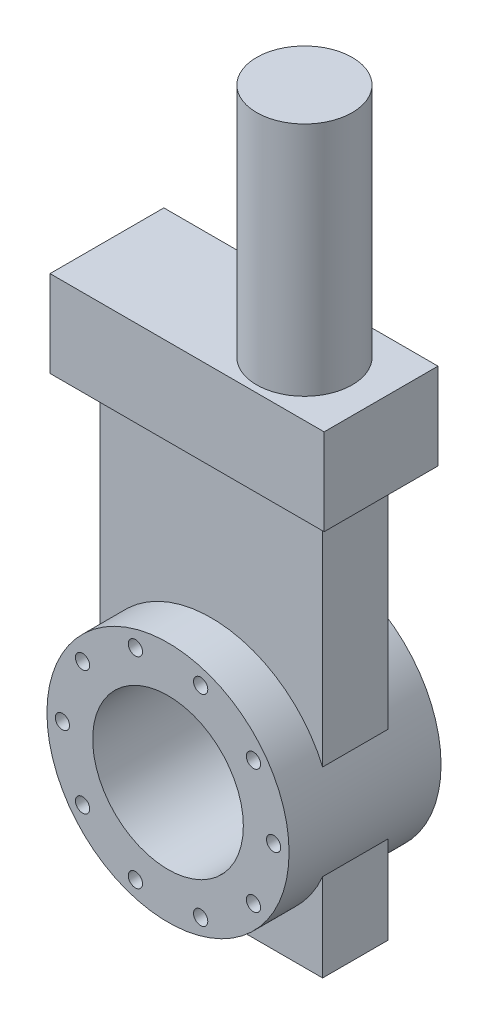
ISO-10303-21;
HEADER;
FILE_DESCRIPTION(('STEP AP214'),'2;1');
FILE_NAME('part.step','',(''),(''),'','','');
FILE_SCHEMA(('AUTOMOTIVE_DESIGN { 1 0 10303 214 1 1 1 1 }'));
ENDSEC;
DATA;
#1=APPLICATION_CONTEXT('core data for automotive mechanical design processes');
#2=APPLICATION_PROTOCOL_DEFINITION('international standard','automotive_design',2000,#1);
#3=PRODUCT_CONTEXT('',#1,'mechanical');
#4=PRODUCT('Part','Part','',(#3));
#5=PRODUCT_RELATED_PRODUCT_CATEGORY('part','',(#4));
#6=PRODUCT_DEFINITION_FORMATION('','',#4);
#7=PRODUCT_DEFINITION_CONTEXT('part definition',#1,'design');
#8=PRODUCT_DEFINITION('design','',#6,#7);
#9=PRODUCT_DEFINITION_SHAPE('','',#8);
#10=(LENGTH_UNIT() NAMED_UNIT(*) SI_UNIT(.MILLI.,.METRE.));
#11=(NAMED_UNIT(*) PLANE_ANGLE_UNIT() SI_UNIT($,.RADIAN.));
#12=(NAMED_UNIT(*) SI_UNIT($,.STERADIAN.) SOLID_ANGLE_UNIT());
#13=UNCERTAINTY_MEASURE_WITH_UNIT(LENGTH_MEASURE(1.E-05),#10,'distance_accuracy_value','');
#14=(GEOMETRIC_REPRESENTATION_CONTEXT(3) GLOBAL_UNCERTAINTY_ASSIGNED_CONTEXT((#13)) GLOBAL_UNIT_ASSIGNED_CONTEXT((#10,
#11,#12)) REPRESENTATION_CONTEXT('',''));
#15=CARTESIAN_POINT('',(0.,0.,0.));
#16=DIRECTION('',(0.,0.,1.));
#17=DIRECTION('',(1.,0.,0.));
#18=AXIS2_PLACEMENT_3D('',#15,#16,#17);
#19=CARTESIAN_POINT('',(-41.6423387636332,48.7154532506677,43.4614345632482));
#20=DIRECTION('',(0.,-1.,0.));
#21=DIRECTION('',(0.,0.,-1.));
#22=AXIS2_PLACEMENT_3D('',#19,#20,#21);
#23=PLANE('',#22);
#24=DIRECTION('',(0.,0.,1.));
#25=VECTOR('',#24,1.);
#26=CARTESIAN_POINT('',(-41.6423387636332,48.7154532506677,-11.7114345632482));
#27=LINE('',#26,#25);
#28=CARTESIAN_POINT('',(-41.6423387636332,48.7154532506677,-11.7114345632482));
#29=VERTEX_POINT('',#28);
#30=CARTESIAN_POINT('',(-41.6423387636332,48.7154532506677,43.4614345632482));
#31=VERTEX_POINT('',#30);
#32=EDGE_CURVE('E124',#29,#31,#27,.T.);
#33=ORIENTED_EDGE('',*,*,#32,.T.);
#34=DIRECTION('',(1.,0.,0.));
#35=VECTOR('',#34,1.);
#36=CARTESIAN_POINT('',(91.1996612363668,48.7154532506677,43.4614345632482));
#37=LINE('',#36,#35);
#38=CARTESIAN_POINT('',(91.1996612363668,48.7154532506677,43.4614345632482));
#39=VERTEX_POINT('',#38);
#40=EDGE_CURVE('E134',#31,#39,#37,.T.);
#41=ORIENTED_EDGE('',*,*,#40,.T.);
#42=DIRECTION('',(0.,0.,-1.));
#43=VECTOR('',#42,1.);
#44=CARTESIAN_POINT('',(91.1996612363668,48.7154532506677,-11.7114345632482));
#45=LINE('',#44,#43);
#46=CARTESIAN_POINT('',(91.1996612363668,48.7154532506677,-11.7114345632482));
#47=VERTEX_POINT('',#46);
#48=EDGE_CURVE('E139',#39,#47,#45,.T.);
#49=ORIENTED_EDGE('',*,*,#48,.T.);
#50=DIRECTION('',(-1.,0.,0.));
#51=VECTOR('',#50,1.);
#52=CARTESIAN_POINT('',(91.1996612363668,48.7154532506677,-11.7114345632482));
#53=LINE('',#52,#51);
#54=EDGE_CURVE('E144',#47,#29,#53,.T.);
#55=ORIENTED_EDGE('',*,*,#54,.T.);
#56=EDGE_LOOP('',(#33,#41,#49,#55));
#57=FACE_BOUND('',#56,.T.);
#58=CARTESIAN_POINT('',(55.1442487211715,48.7154532506677,16.9467266171099));
#59=DIRECTION('',(0.,-1.,0.));
#60=DIRECTION('',(0.,0.,-1.));
#61=AXIS2_PLACEMENT_3D('',#58,#59,#60);
#62=CIRCLE('',#61,23.1745918894452);
#63=CARTESIAN_POINT('',(55.1442487211715,48.7154532506677,-6.22786527233528));
#64=VERTEX_POINT('',#63);
#65=EDGE_CURVE('E11',#64,#64,#62,.F.);
#66=ORIENTED_EDGE('',*,*,#65,.F.);
#67=EDGE_LOOP('',(#66));
#68=FACE_BOUND('',#67,.T.);
#69=ADVANCED_FACE('F31',(#57,#68),#23,.F.);
#70=CARTESIAN_POINT('',(-29.1963387636332,27.7604532506677,31.75));
#71=DIRECTION('',(1.,0.,0.));
#72=DIRECTION('',(0.,1.,0.));
#73=AXIS2_PLACEMENT_3D('',#70,#71,#72);
#74=PLANE('',#73);
#75=DIRECTION('',(0.,-1.,0.));
#76=VECTOR('',#75,1.);
#77=CARTESIAN_POINT('',(-29.1963387636332,27.7604532506677,31.75));
#78=LINE('',#77,#76);
#79=CARTESIAN_POINT('',(-29.1963387636332,6.80545325066767,31.75));
#80=VERTEX_POINT('',#79);
#81=CARTESIAN_POINT('',(-29.1963387636332,-104.045207681113,31.75));
#82=VERTEX_POINT('',#81);
#83=EDGE_CURVE('E257',#80,#82,#78,.T.);
#84=ORIENTED_EDGE('',*,*,#83,.F.);
#85=DIRECTION('',(0.,0.,-1.));
#86=VECTOR('',#85,1.);
#87=CARTESIAN_POINT('',(-29.1963387636332,6.80545325066767,31.75));
#88=LINE('',#87,#86);
#89=CARTESIAN_POINT('',(-29.1963387636332,6.80545325066767,0.));
#90=VERTEX_POINT('',#89);
#91=EDGE_CURVE('E169',#80,#90,#88,.T.);
#92=ORIENTED_EDGE('',*,*,#91,.T.);
#93=DIRECTION('',(0.,-1.,0.));
#94=VECTOR('',#93,1.);
#95=CARTESIAN_POINT('',(-29.1963387636332,27.7604532506677,0.));
#96=LINE('',#95,#94);
#97=CARTESIAN_POINT('',(-29.1963387636332,-104.045207681113,0.));
#98=VERTEX_POINT('',#97);
#99=EDGE_CURVE('E267',#90,#98,#96,.T.);
#100=ORIENTED_EDGE('',*,*,#99,.T.);
#101=DIRECTION('',(0.,0.,1.));
#102=VECTOR('',#101,1.);
#103=CARTESIAN_POINT('',(-29.1963387636332,-104.045207681113,-20.955));
#104=LINE('',#103,#102);
#105=EDGE_CURVE('E254',#98,#82,#104,.T.);
#106=ORIENTED_EDGE('',*,*,#105,.T.);
#107=EDGE_LOOP('',(#84,#92,#100,#106));
#108=FACE_BOUND('',#107,.T.);
#109=ADVANCED_FACE('F327',(#108),#74,.F.);
#110=CARTESIAN_POINT('',(-29.1963387636332,-192.584546749332,31.75));
#111=DIRECTION('',(0.,0.,1.));
#112=DIRECTION('',(1.,0.,0.));
#113=AXIS2_PLACEMENT_3D('',#110,#111,#112);
#114=PLANE('',#113);
#115=DIRECTION('',(1.,0.,0.));
#116=VECTOR('',#115,1.);
#117=CARTESIAN_POINT('',(-29.1963387636332,6.80545325066767,31.75));
#118=LINE('',#117,#116);
#119=CARTESIAN_POINT('',(78.7536612363668,6.80545325066767,31.75));
#120=VERTEX_POINT('',#119);
#121=EDGE_CURVE('E46',#80,#120,#118,.T.);
#122=ORIENTED_EDGE('',*,*,#121,.F.);
#123=ORIENTED_EDGE('',*,*,#83,.T.);
#124=CARTESIAN_POINT('',(24.7786612363668,-127.052546749332,31.75));
#125=DIRECTION('',(0.,0.,1.));
#126=DIRECTION('',(1.,0.,0.));
#127=AXIS2_PLACEMENT_3D('',#124,#125,#126);
#128=CIRCLE('',#127,58.674);
#129=CARTESIAN_POINT('',(78.7536612363668,-104.045207681113,31.75));
#130=VERTEX_POINT('',#129);
#131=EDGE_CURVE('E251',#130,#82,#128,.T.);
#132=ORIENTED_EDGE('',*,*,#131,.F.);
#133=DIRECTION('',(0.,1.,0.));
#134=VECTOR('',#133,1.);
#135=CARTESIAN_POINT('',(78.7536612363668,27.7604532506677,31.75));
#136=LINE('',#135,#134);
#137=EDGE_CURVE('E262',#130,#120,#136,.T.);
#138=ORIENTED_EDGE('',*,*,#137,.T.);
#139=EDGE_LOOP('',(#122,#123,#132,#138));
#140=FACE_BOUND('',#139,.T.);
#141=ADVANCED_FACE('F299',(#140),#114,.T.);
#142=CARTESIAN_POINT('',(-29.1963387636332,-192.584546749332,0.));
#143=DIRECTION('',(0.,0.,1.));
#144=DIRECTION('',(1.,0.,0.));
#145=AXIS2_PLACEMENT_3D('',#142,#143,#144);
#146=PLANE('',#145);
#147=ORIENTED_EDGE('',*,*,#99,.F.);
#148=DIRECTION('',(1.,0.,0.));
#149=VECTOR('',#148,1.);
#150=CARTESIAN_POINT('',(-29.1963387636332,6.80545325066767,0.));
#151=LINE('',#150,#149);
#152=CARTESIAN_POINT('',(78.7536612363668,6.80545325066767,0.));
#153=VERTEX_POINT('',#152);
#154=EDGE_CURVE('E162',#90,#153,#151,.T.);
#155=ORIENTED_EDGE('',*,*,#154,.T.);
#156=DIRECTION('',(0.,1.,0.));
#157=VECTOR('',#156,1.);
#158=CARTESIAN_POINT('',(78.7536612363668,27.7604532506677,0.));
#159=LINE('',#158,#157);
#160=CARTESIAN_POINT('',(78.7536612363668,-104.045207681113,0.));
#161=VERTEX_POINT('',#160);
#162=EDGE_CURVE('E272',#161,#153,#159,.T.);
#163=ORIENTED_EDGE('',*,*,#162,.F.);
#164=CARTESIAN_POINT('',(24.7786612363668,-127.052546749332,0.));
#165=DIRECTION('',(0.,0.,1.));
#166=DIRECTION('',(1.,0.,0.));
#167=AXIS2_PLACEMENT_3D('',#164,#165,#166);
#168=CIRCLE('',#167,58.674);
#169=EDGE_CURVE('E282',#161,#98,#168,.T.);
#170=ORIENTED_EDGE('',*,*,#169,.T.);
#171=EDGE_LOOP('',(#147,#155,#163,#170));
#172=FACE_BOUND('',#171,.T.);
#173=ADVANCED_FACE('F291',(#172),#146,.F.);
#174=CARTESIAN_POINT('',(78.7536612363668,27.7604532506677,31.75));
#175=DIRECTION('',(-1.,0.,0.));
#176=DIRECTION('',(0.,-1.,0.));
#177=AXIS2_PLACEMENT_3D('',#174,#175,#176);
#178=PLANE('',#177);
#179=ORIENTED_EDGE('',*,*,#162,.T.);
#180=DIRECTION('',(0.,0.,1.));
#181=VECTOR('',#180,1.);
#182=CARTESIAN_POINT('',(78.7536612363668,6.80545325066767,31.75));
#183=LINE('',#182,#181);
#184=EDGE_CURVE('E39',#153,#120,#183,.T.);
#185=ORIENTED_EDGE('',*,*,#184,.T.);
#186=ORIENTED_EDGE('',*,*,#137,.F.);
#187=DIRECTION('',(0.,0.,1.));
#188=VECTOR('',#187,1.);
#189=CARTESIAN_POINT('',(78.7536612363668,-104.045207681113,-20.955));
#190=LINE('',#189,#188);
#191=EDGE_CURVE('E250',#130,#161,#190,.F.);
#192=ORIENTED_EDGE('',*,*,#191,.T.);
#193=EDGE_LOOP('',(#179,#185,#186,#192));
#194=FACE_BOUND('',#193,.T.);
#195=ADVANCED_FACE('F297',(#194),#178,.F.);
#196=CARTESIAN_POINT('',(24.7786612363668,-127.052546749332,-20.955));
#197=DIRECTION('',(0.,0.,1.));
#198=DIRECTION('',(1.,0.,0.));
#199=AXIS2_PLACEMENT_3D('',#196,#197,#198);
#200=CYLINDRICAL_SURFACE('',#199,58.674);
#201=ORIENTED_EDGE('',*,*,#191,.F.);
#202=ORIENTED_EDGE('',*,*,#131,.T.);
#203=ORIENTED_EDGE('',*,*,#105,.F.);
#204=ORIENTED_EDGE('',*,*,#169,.F.);
#205=EDGE_LOOP('',(#201,#202,#203,#204));
#206=FACE_BOUND('',#205,.T.);
#207=DIRECTION('',(0.,0.,1.));
#208=VECTOR('',#207,1.);
#209=CARTESIAN_POINT('',(-29.1963387636332,-150.059885817551,-20.955));
#210=LINE('',#209,#208);
#211=CARTESIAN_POINT('',(-29.1963387636332,-150.059885817551,31.75));
#212=VERTEX_POINT('',#211);
#213=CARTESIAN_POINT('',(-29.1963387636332,-150.059885817551,0.));
#214=VERTEX_POINT('',#213);
#215=EDGE_CURVE('E245',#212,#214,#210,.F.);
#216=ORIENTED_EDGE('',*,*,#215,.F.);
#217=CARTESIAN_POINT('',(78.7536612363668,-150.059885817551,31.75));
#218=VERTEX_POINT('',#217);
#219=EDGE_CURVE('E248',#212,#218,#128,.T.);
#220=ORIENTED_EDGE('',*,*,#219,.T.);
#221=DIRECTION('',(0.,0.,1.));
#222=VECTOR('',#221,1.);
#223=CARTESIAN_POINT('',(78.7536612363668,-150.059885817551,-20.955));
#224=LINE('',#223,#222);
#225=CARTESIAN_POINT('',(78.7536612363668,-150.059885817551,0.));
#226=VERTEX_POINT('',#225);
#227=EDGE_CURVE('E54',#226,#218,#224,.T.);
#228=ORIENTED_EDGE('',*,*,#227,.F.);
#229=EDGE_CURVE('E281',#214,#226,#168,.T.);
#230=ORIENTED_EDGE('',*,*,#229,.F.);
#231=EDGE_LOOP('',(#216,#220,#228,#230));
#232=FACE_BOUND('',#231,.T.);
#233=CARTESIAN_POINT('',(24.7786612363668,-127.052546749332,-20.955));
#234=DIRECTION('',(0.,0.,1.));
#235=DIRECTION('',(1.,0.,0.));
#236=AXIS2_PLACEMENT_3D('',#233,#234,#235);
#237=CIRCLE('',#236,58.674);
#238=CARTESIAN_POINT('',(83.4526612363668,-127.052546749332,-20.955));
#239=VERTEX_POINT('',#238);
#240=EDGE_CURVE('E241',#239,#239,#237,.T.);
#241=ORIENTED_EDGE('',*,*,#240,.T.);
#242=EDGE_LOOP('',(#241));
#243=FACE_BOUND('',#242,.T.);
#244=CARTESIAN_POINT('',(24.7786612363668,-127.052546749332,52.705));
#245=DIRECTION('',(0.,0.,1.));
#246=DIRECTION('',(1.,0.,0.));
#247=AXIS2_PLACEMENT_3D('',#244,#245,#246);
#248=CIRCLE('',#247,58.674);
#249=CARTESIAN_POINT('',(83.4526612363668,-127.052546749332,52.705));
#250=VERTEX_POINT('',#249);
#251=EDGE_CURVE('E236',#250,#250,#248,.T.);
#252=ORIENTED_EDGE('',*,*,#251,.F.);
#253=EDGE_LOOP('',(#252));
#254=FACE_BOUND('',#253,.T.);
#255=ADVANCED_FACE('F294',(#206,#232,#243,#254),#200,.T.);
#256=CARTESIAN_POINT('',(24.7786612363668,-127.052546749332,-20.955));
#257=DIRECTION('',(0.,0.,1.));
#258=DIRECTION('',(1.,0.,0.));
#259=AXIS2_PLACEMENT_3D('',#256,#257,#258);
#260=PLANE('',#259);
#261=CARTESIAN_POINT('',(40.5944600254703,-78.3765231888299,-20.955));
#262=DIRECTION('',(0.,0.,1.));
#263=DIRECTION('',(1.,0.,0.));
#264=AXIS2_PLACEMENT_3D('',#261,#262,#263);
#265=CIRCLE('',#264,3.45439999999998);
#266=CARTESIAN_POINT('',(44.0488600254702,-78.3765231888299,-20.955));
#267=VERTEX_POINT('',#266);
#268=EDGE_CURVE('E175',#267,#267,#265,.T.);
#269=ORIENTED_EDGE('',*,*,#268,.T.);
#270=EDGE_LOOP('',(#269));
#271=FACE_BOUND('',#270,.T.);
#272=CARTESIAN_POINT('',(66.1849600254706,-96.9691097517508,-20.955));
#273=DIRECTION('',(0.,0.,1.));
#274=DIRECTION('',(1.,0.,0.));
#275=AXIS2_PLACEMENT_3D('',#272,#273,#274);
#276=CIRCLE('',#275,3.45439999999998);
#277=CARTESIAN_POINT('',(69.6393600254706,-96.9691097517508,-20.955));
#278=VERTEX_POINT('',#277);
#279=EDGE_CURVE('E181',#278,#278,#276,.T.);
#280=ORIENTED_EDGE('',*,*,#279,.T.);
#281=EDGE_LOOP('',(#280));
#282=FACE_BOUND('',#281,.T.);
#283=CARTESIAN_POINT('',(75.9596612363668,-127.052546749332,-20.955));
#284=DIRECTION('',(0.,0.,1.));
#285=DIRECTION('',(1.,0.,0.));
#286=AXIS2_PLACEMENT_3D('',#283,#284,#285);
#287=CIRCLE('',#286,3.45439999999998);
#288=CARTESIAN_POINT('',(79.4140612363668,-127.052546749332,-20.955));
#289=VERTEX_POINT('',#288);
#290=EDGE_CURVE('E187',#289,#289,#287,.T.);
#291=ORIENTED_EDGE('',*,*,#290,.T.);
#292=EDGE_LOOP('',(#291));
#293=FACE_BOUND('',#292,.T.);
#294=CARTESIAN_POINT('',(66.1849600254713,-157.135983746913,-20.955));
#295=DIRECTION('',(0.,0.,1.));
#296=DIRECTION('',(1.,0.,0.));
#297=AXIS2_PLACEMENT_3D('',#294,#295,#296);
#298=CIRCLE('',#297,3.45439999999998);
#299=CARTESIAN_POINT('',(69.6393600254712,-157.135983746913,-20.955));
#300=VERTEX_POINT('',#299);
#301=EDGE_CURVE('E193',#300,#300,#298,.T.);
#302=ORIENTED_EDGE('',*,*,#301,.T.);
#303=EDGE_LOOP('',(#302));
#304=FACE_BOUND('',#303,.T.);
#305=CARTESIAN_POINT('',(40.5944600254714,-175.728570309835,-20.955));
#306=DIRECTION('',(0.,0.,1.));
#307=DIRECTION('',(1.,0.,0.));
#308=AXIS2_PLACEMENT_3D('',#305,#306,#307);
#309=CIRCLE('',#308,3.45439999999998);
#310=CARTESIAN_POINT('',(44.0488600254713,-175.728570309835,-20.955));
#311=VERTEX_POINT('',#310);
#312=EDGE_CURVE('E199',#311,#311,#309,.T.);
#313=ORIENTED_EDGE('',*,*,#312,.T.);
#314=EDGE_LOOP('',(#313));
#315=FACE_BOUND('',#314,.T.);
#316=CARTESIAN_POINT('',(8.96286244726292,-175.728570309835,-20.955));
#317=DIRECTION('',(0.,0.,1.));
#318=DIRECTION('',(1.,0.,0.));
#319=AXIS2_PLACEMENT_3D('',#316,#317,#318);
#320=CIRCLE('',#319,3.45439999999998);
#321=CARTESIAN_POINT('',(12.4172624472629,-175.728570309835,-20.955));
#322=VERTEX_POINT('',#321);
#323=EDGE_CURVE('E205',#322,#322,#320,.T.);
#324=ORIENTED_EDGE('',*,*,#323,.T.);
#325=EDGE_LOOP('',(#324));
#326=FACE_BOUND('',#325,.T.);
#327=CARTESIAN_POINT('',(-16.6276375527372,-157.135983746914,-20.955));
#328=DIRECTION('',(0.,0.,1.));
#329=DIRECTION('',(1.,0.,0.));
#330=AXIS2_PLACEMENT_3D('',#327,#328,#329);
#331=CIRCLE('',#330,3.45439999999998);
#332=CARTESIAN_POINT('',(-13.1732375527373,-157.135983746914,-20.955));
#333=VERTEX_POINT('',#332);
#334=EDGE_CURVE('E211',#333,#333,#331,.T.);
#335=ORIENTED_EDGE('',*,*,#334,.T.);
#336=EDGE_LOOP('',(#335));
#337=FACE_BOUND('',#336,.T.);
#338=CARTESIAN_POINT('',(-26.4023387636332,-127.052546749333,-20.955));
#339=DIRECTION('',(0.,0.,1.));
#340=DIRECTION('',(1.,0.,0.));
#341=AXIS2_PLACEMENT_3D('',#338,#339,#340);
#342=CIRCLE('',#341,3.45439999999998);
#343=CARTESIAN_POINT('',(-22.9479387636332,-127.052546749333,-20.955));
#344=VERTEX_POINT('',#343);
#345=EDGE_CURVE('E217',#344,#344,#342,.T.);
#346=ORIENTED_EDGE('',*,*,#345,.T.);
#347=EDGE_LOOP('',(#346));
#348=FACE_BOUND('',#347,.T.);
#349=CARTESIAN_POINT('',(-16.6276375527375,-96.9691097517514,-20.955));
#350=DIRECTION('',(0.,0.,1.));
#351=DIRECTION('',(1.,0.,0.));
#352=AXIS2_PLACEMENT_3D('',#349,#350,#351);
#353=CIRCLE('',#352,3.45439999999998);
#354=CARTESIAN_POINT('',(-13.1732375527375,-96.9691097517514,-20.955));
#355=VERTEX_POINT('',#354);
#356=EDGE_CURVE('E223',#355,#355,#353,.T.);
#357=ORIENTED_EDGE('',*,*,#356,.T.);
#358=EDGE_LOOP('',(#357));
#359=FACE_BOUND('',#358,.T.);
#360=CARTESIAN_POINT('',(8.96286244726254,-78.3765231888301,-20.955));
#361=DIRECTION('',(0.,0.,1.));
#362=DIRECTION('',(1.,0.,0.));
#363=AXIS2_PLACEMENT_3D('',#360,#361,#362);
#364=CIRCLE('',#363,3.45439999999998);
#365=CARTESIAN_POINT('',(12.4172624472625,-78.3765231888301,-20.955));
#366=VERTEX_POINT('',#365);
#367=EDGE_CURVE('E229',#366,#366,#364,.T.);
#368=ORIENTED_EDGE('',*,*,#367,.T.);
#369=EDGE_LOOP('',(#368));
#370=FACE_BOUND('',#369,.T.);
#371=CARTESIAN_POINT('',(24.7786612363668,-127.052546749332,-20.955));
#372=DIRECTION('',(0.,0.,1.));
#373=DIRECTION('',(1.,0.,0.));
#374=AXIS2_PLACEMENT_3D('',#371,#372,#373);
#375=CIRCLE('',#374,36.5125);
#376=CARTESIAN_POINT('',(61.2911612363668,-127.052546749332,-20.955));
#377=VERTEX_POINT('',#376);
#378=EDGE_CURVE('E233',#377,#377,#375,.T.);
#379=ORIENTED_EDGE('',*,*,#378,.T.);
#380=EDGE_LOOP('',(#379));
#381=FACE_BOUND('',#380,.T.);
#382=ORIENTED_EDGE('',*,*,#240,.F.);
#383=EDGE_LOOP('',(#382));
#384=FACE_BOUND('',#383,.T.);
#385=ADVANCED_FACE('F402',(#271,#282,#293,#304,#315,#326,#337,#348,#359,#370,#381,#384),#260,.F.);
#386=CARTESIAN_POINT('',(24.7786612363668,-127.052546749332,52.705));
#387=DIRECTION('',(0.,0.,1.));
#388=DIRECTION('',(1.,0.,0.));
#389=AXIS2_PLACEMENT_3D('',#386,#387,#388);
#390=PLANE('',#389);
#391=CARTESIAN_POINT('',(40.5944600254703,-78.3765231888299,52.705));
#392=DIRECTION('',(0.,0.,1.));
#393=DIRECTION('',(1.,0.,0.));
#394=AXIS2_PLACEMENT_3D('',#391,#392,#393);
#395=CIRCLE('',#394,3.45439999999999);
#396=CARTESIAN_POINT('',(44.0488600254703,-78.3765231888299,52.705));
#397=VERTEX_POINT('',#396);
#398=EDGE_CURVE('E172',#397,#397,#395,.T.);
#399=ORIENTED_EDGE('',*,*,#398,.F.);
#400=EDGE_LOOP('',(#399));
#401=FACE_BOUND('',#400,.T.);
#402=CARTESIAN_POINT('',(66.1849600254706,-96.9691097517508,52.705));
#403=DIRECTION('',(0.,0.,1.));
#404=DIRECTION('',(1.,0.,0.));
#405=AXIS2_PLACEMENT_3D('',#402,#403,#404);
#406=CIRCLE('',#405,3.45439999999998);
#407=CARTESIAN_POINT('',(69.6393600254706,-96.9691097517508,52.705));
#408=VERTEX_POINT('',#407);
#409=EDGE_CURVE('E178',#408,#408,#406,.T.);
#410=ORIENTED_EDGE('',*,*,#409,.F.);
#411=EDGE_LOOP('',(#410));
#412=FACE_BOUND('',#411,.T.);
#413=CARTESIAN_POINT('',(75.9596612363668,-127.052546749332,52.705));
#414=DIRECTION('',(0.,0.,1.));
#415=DIRECTION('',(1.,0.,0.));
#416=AXIS2_PLACEMENT_3D('',#413,#414,#415);
#417=CIRCLE('',#416,3.45439999999998);
#418=CARTESIAN_POINT('',(79.4140612363668,-127.052546749332,52.705));
#419=VERTEX_POINT('',#418);
#420=EDGE_CURVE('E184',#419,#419,#417,.T.);
#421=ORIENTED_EDGE('',*,*,#420,.F.);
#422=EDGE_LOOP('',(#421));
#423=FACE_BOUND('',#422,.T.);
#424=CARTESIAN_POINT('',(66.1849600254713,-157.135983746913,52.705));
#425=DIRECTION('',(0.,0.,1.));
#426=DIRECTION('',(1.,0.,0.));
#427=AXIS2_PLACEMENT_3D('',#424,#425,#426);
#428=CIRCLE('',#427,3.45439999999998);
#429=CARTESIAN_POINT('',(69.6393600254712,-157.135983746913,52.705));
#430=VERTEX_POINT('',#429);
#431=EDGE_CURVE('E190',#430,#430,#428,.T.);
#432=ORIENTED_EDGE('',*,*,#431,.F.);
#433=EDGE_LOOP('',(#432));
#434=FACE_BOUND('',#433,.T.);
#435=CARTESIAN_POINT('',(40.5944600254714,-175.728570309835,52.705));
#436=DIRECTION('',(0.,0.,1.));
#437=DIRECTION('',(1.,0.,0.));
#438=AXIS2_PLACEMENT_3D('',#435,#436,#437);
#439=CIRCLE('',#438,3.45439999999999);
#440=CARTESIAN_POINT('',(44.0488600254713,-175.728570309835,52.705));
#441=VERTEX_POINT('',#440);
#442=EDGE_CURVE('E196',#441,#441,#439,.T.);
#443=ORIENTED_EDGE('',*,*,#442,.F.);
#444=EDGE_LOOP('',(#443));
#445=FACE_BOUND('',#444,.T.);
#446=CARTESIAN_POINT('',(8.96286244726292,-175.728570309835,52.705));
#447=DIRECTION('',(0.,0.,1.));
#448=DIRECTION('',(1.,0.,0.));
#449=AXIS2_PLACEMENT_3D('',#446,#447,#448);
#450=CIRCLE('',#449,3.45439999999999);
#451=CARTESIAN_POINT('',(12.4172624472629,-175.728570309835,52.705));
#452=VERTEX_POINT('',#451);
#453=EDGE_CURVE('E202',#452,#452,#450,.T.);
#454=ORIENTED_EDGE('',*,*,#453,.F.);
#455=EDGE_LOOP('',(#454));
#456=FACE_BOUND('',#455,.T.);
#457=CARTESIAN_POINT('',(-16.6276375527372,-157.135983746914,52.705));
#458=DIRECTION('',(0.,0.,1.));
#459=DIRECTION('',(1.,0.,0.));
#460=AXIS2_PLACEMENT_3D('',#457,#458,#459);
#461=CIRCLE('',#460,3.45439999999999);
#462=CARTESIAN_POINT('',(-13.1732375527373,-157.135983746914,52.705));
#463=VERTEX_POINT('',#462);
#464=EDGE_CURVE('E208',#463,#463,#461,.T.);
#465=ORIENTED_EDGE('',*,*,#464,.F.);
#466=EDGE_LOOP('',(#465));
#467=FACE_BOUND('',#466,.T.);
#468=CARTESIAN_POINT('',(-26.4023387636332,-127.052546749333,52.705));
#469=DIRECTION('',(0.,0.,1.));
#470=DIRECTION('',(1.,0.,0.));
#471=AXIS2_PLACEMENT_3D('',#468,#469,#470);
#472=CIRCLE('',#471,3.45439999999999);
#473=CARTESIAN_POINT('',(-22.9479387636332,-127.052546749333,52.705));
#474=VERTEX_POINT('',#473);
#475=EDGE_CURVE('E214',#474,#474,#472,.T.);
#476=ORIENTED_EDGE('',*,*,#475,.F.);
#477=EDGE_LOOP('',(#476));
#478=FACE_BOUND('',#477,.T.);
#479=CARTESIAN_POINT('',(-16.6276375527375,-96.9691097517514,52.705));
#480=DIRECTION('',(0.,0.,1.));
#481=DIRECTION('',(1.,0.,0.));
#482=AXIS2_PLACEMENT_3D('',#479,#480,#481);
#483=CIRCLE('',#482,3.45439999999999);
#484=CARTESIAN_POINT('',(-13.1732375527375,-96.9691097517514,52.705));
#485=VERTEX_POINT('',#484);
#486=EDGE_CURVE('E220',#485,#485,#483,.T.);
#487=ORIENTED_EDGE('',*,*,#486,.F.);
#488=EDGE_LOOP('',(#487));
#489=FACE_BOUND('',#488,.T.);
#490=CARTESIAN_POINT('',(8.96286244726254,-78.3765231888301,52.705));
#491=DIRECTION('',(0.,0.,1.));
#492=DIRECTION('',(1.,0.,0.));
#493=AXIS2_PLACEMENT_3D('',#490,#491,#492);
#494=CIRCLE('',#493,3.45439999999999);
#495=CARTESIAN_POINT('',(12.4172624472625,-78.3765231888301,52.705));
#496=VERTEX_POINT('',#495);
#497=EDGE_CURVE('E226',#496,#496,#494,.T.);
#498=ORIENTED_EDGE('',*,*,#497,.F.);
#499=EDGE_LOOP('',(#498));
#500=FACE_BOUND('',#499,.T.);
#501=CARTESIAN_POINT('',(24.7786612363668,-127.052546749332,52.705));
#502=DIRECTION('',(0.,0.,1.));
#503=DIRECTION('',(1.,0.,0.));
#504=AXIS2_PLACEMENT_3D('',#501,#502,#503);
#505=CIRCLE('',#504,36.5125);
#506=CARTESIAN_POINT('',(61.2911612363668,-127.052546749332,52.705));
#507=VERTEX_POINT('',#506);
#508=EDGE_CURVE('E232',#507,#507,#505,.T.);
#509=ORIENTED_EDGE('',*,*,#508,.F.);
#510=EDGE_LOOP('',(#509));
#511=FACE_BOUND('',#510,.T.);
#512=ORIENTED_EDGE('',*,*,#251,.T.);
#513=EDGE_LOOP('',(#512));
#514=FACE_BOUND('',#513,.T.);
#515=ADVANCED_FACE('F399',(#401,#412,#423,#434,#445,#456,#467,#478,#489,#500,#511,#514),#390,.T.);
#516=CARTESIAN_POINT('',(-29.1963387636332,-192.584546749332,31.75));
#517=DIRECTION('',(0.,1.,0.));
#518=DIRECTION('',(0.,0.,1.));
#519=AXIS2_PLACEMENT_3D('',#516,#517,#518);
#520=PLANE('',#519);
#521=DIRECTION('',(1.,0.,0.));
#522=VECTOR('',#521,1.);
#523=CARTESIAN_POINT('',(-29.1963387636332,-192.584546749332,0.));
#524=LINE('',#523,#522);
#525=CARTESIAN_POINT('',(-29.1963387636332,-192.584546749332,0.));
#526=VERTEX_POINT('',#525);
#527=CARTESIAN_POINT('',(78.7536612363668,-192.584546749332,0.));
#528=VERTEX_POINT('',#527);
#529=EDGE_CURVE('E269',#526,#528,#524,.T.);
#530=ORIENTED_EDGE('',*,*,#529,.T.);
#531=DIRECTION('',(0.,0.,-1.));
#532=VECTOR('',#531,1.);
#533=CARTESIAN_POINT('',(78.7536612363668,-192.584546749332,31.75));
#534=LINE('',#533,#532);
#535=CARTESIAN_POINT('',(78.7536612363668,-192.584546749332,31.75));
#536=VERTEX_POINT('',#535);
#537=EDGE_CURVE('E266',#536,#528,#534,.T.);
#538=ORIENTED_EDGE('',*,*,#537,.F.);
#539=DIRECTION('',(1.,0.,0.));
#540=VECTOR('',#539,1.);
#541=CARTESIAN_POINT('',(-29.1963387636332,-192.584546749332,31.75));
#542=LINE('',#541,#540);
#543=CARTESIAN_POINT('',(-29.1963387636332,-192.584546749332,31.75));
#544=VERTEX_POINT('',#543);
#545=EDGE_CURVE('E259',#544,#536,#542,.T.);
#546=ORIENTED_EDGE('',*,*,#545,.F.);
#547=DIRECTION('',(0.,0.,-1.));
#548=VECTOR('',#547,1.);
#549=CARTESIAN_POINT('',(-29.1963387636332,-192.584546749332,31.75));
#550=LINE('',#549,#548);
#551=EDGE_CURVE('E278',#544,#526,#550,.T.);
#552=ORIENTED_EDGE('',*,*,#551,.T.);
#553=EDGE_LOOP('',(#530,#538,#546,#552));
#554=FACE_BOUND('',#553,.T.);
#555=ADVANCED_FACE('F312',(#554),#520,.F.);
#556=ORIENTED_EDGE('',*,*,#219,.F.);
#557=EDGE_CURVE('E260',#212,#544,#78,.T.);
#558=ORIENTED_EDGE('',*,*,#557,.T.);
#559=ORIENTED_EDGE('',*,*,#545,.T.);
#560=EDGE_CURVE('E263',#536,#218,#136,.T.);
#561=ORIENTED_EDGE('',*,*,#560,.T.);
#562=EDGE_LOOP('',(#556,#558,#559,#561));
#563=FACE_BOUND('',#562,.T.);
#564=ADVANCED_FACE('F316',(#563),#114,.T.);
#565=EDGE_CURVE('E270',#214,#526,#96,.T.);
#566=ORIENTED_EDGE('',*,*,#565,.F.);
#567=ORIENTED_EDGE('',*,*,#229,.T.);
#568=EDGE_CURVE('E273',#528,#226,#159,.T.);
#569=ORIENTED_EDGE('',*,*,#568,.F.);
#570=ORIENTED_EDGE('',*,*,#529,.F.);
#571=EDGE_LOOP('',(#566,#567,#569,#570));
#572=FACE_BOUND('',#571,.T.);
#573=ADVANCED_FACE('F308',(#572),#146,.F.);
#574=ORIENTED_EDGE('',*,*,#568,.T.);
#575=ORIENTED_EDGE('',*,*,#227,.T.);
#576=ORIENTED_EDGE('',*,*,#560,.F.);
#577=ORIENTED_EDGE('',*,*,#537,.T.);
#578=EDGE_LOOP('',(#574,#575,#576,#577));
#579=FACE_BOUND('',#578,.T.);
#580=ADVANCED_FACE('F319',(#579),#178,.F.);
#581=ORIENTED_EDGE('',*,*,#557,.F.);
#582=ORIENTED_EDGE('',*,*,#215,.T.);
#583=ORIENTED_EDGE('',*,*,#565,.T.);
#584=ORIENTED_EDGE('',*,*,#551,.F.);
#585=EDGE_LOOP('',(#581,#582,#583,#584));
#586=FACE_BOUND('',#585,.T.);
#587=ADVANCED_FACE('F33',(#586),#74,.F.);
#588=CARTESIAN_POINT('',(24.7786612363668,-127.052546749332,-20.955));
#589=DIRECTION('',(0.,0.,1.));
#590=DIRECTION('',(1.,0.,0.));
#591=AXIS2_PLACEMENT_3D('',#588,#589,#590);
#592=CYLINDRICAL_SURFACE('',#591,36.5125);
#593=ORIENTED_EDGE('',*,*,#378,.F.);
#594=EDGE_LOOP('',(#593));
#595=FACE_BOUND('',#594,.T.);
#596=ORIENTED_EDGE('',*,*,#508,.T.);
#597=EDGE_LOOP('',(#596));
#598=FACE_BOUND('',#597,.T.);
#599=ADVANCED_FACE('F326',(#595,#598),#592,.F.);
#600=CARTESIAN_POINT('',(8.96286244726254,-78.3765231888301,52.705));
#601=DIRECTION('',(0.,0.,1.));
#602=DIRECTION('',(1.,0.,0.));
#603=AXIS2_PLACEMENT_3D('',#600,#601,#602);
#604=CYLINDRICAL_SURFACE('',#603,3.45439999999999);
#605=ORIENTED_EDGE('',*,*,#367,.F.);
#606=EDGE_LOOP('',(#605));
#607=FACE_BOUND('',#606,.T.);
#608=ORIENTED_EDGE('',*,*,#497,.T.);
#609=EDGE_LOOP('',(#608));
#610=FACE_BOUND('',#609,.T.);
#611=ADVANCED_FACE('F391',(#607,#610),#604,.F.);
#612=CARTESIAN_POINT('',(-16.6276375527375,-96.9691097517514,52.705));
#613=DIRECTION('',(0.,0.,1.));
#614=DIRECTION('',(1.,0.,0.));
#615=AXIS2_PLACEMENT_3D('',#612,#613,#614);
#616=CYLINDRICAL_SURFACE('',#615,3.45439999999999);
#617=ORIENTED_EDGE('',*,*,#356,.F.);
#618=EDGE_LOOP('',(#617));
#619=FACE_BOUND('',#618,.T.);
#620=ORIENTED_EDGE('',*,*,#486,.T.);
#621=EDGE_LOOP('',(#620));
#622=FACE_BOUND('',#621,.T.);
#623=ADVANCED_FACE('F387',(#619,#622),#616,.F.);
#624=CARTESIAN_POINT('',(-26.4023387636332,-127.052546749333,52.705));
#625=DIRECTION('',(0.,0.,1.));
#626=DIRECTION('',(1.,0.,0.));
#627=AXIS2_PLACEMENT_3D('',#624,#625,#626);
#628=CYLINDRICAL_SURFACE('',#627,3.45439999999999);
#629=ORIENTED_EDGE('',*,*,#345,.F.);
#630=EDGE_LOOP('',(#629));
#631=FACE_BOUND('',#630,.T.);
#632=ORIENTED_EDGE('',*,*,#475,.T.);
#633=EDGE_LOOP('',(#632));
#634=FACE_BOUND('',#633,.T.);
#635=ADVANCED_FACE('F383',(#631,#634),#628,.F.);
#636=CARTESIAN_POINT('',(-16.6276375527372,-157.135983746914,52.705));
#637=DIRECTION('',(0.,0.,1.));
#638=DIRECTION('',(1.,0.,0.));
#639=AXIS2_PLACEMENT_3D('',#636,#637,#638);
#640=CYLINDRICAL_SURFACE('',#639,3.45439999999999);
#641=ORIENTED_EDGE('',*,*,#334,.F.);
#642=EDGE_LOOP('',(#641));
#643=FACE_BOUND('',#642,.T.);
#644=ORIENTED_EDGE('',*,*,#464,.T.);
#645=EDGE_LOOP('',(#644));
#646=FACE_BOUND('',#645,.T.);
#647=ADVANCED_FACE('F379',(#643,#646),#640,.F.);
#648=CARTESIAN_POINT('',(8.96286244726292,-175.728570309835,52.705));
#649=DIRECTION('',(0.,0.,1.));
#650=DIRECTION('',(1.,0.,0.));
#651=AXIS2_PLACEMENT_3D('',#648,#649,#650);
#652=CYLINDRICAL_SURFACE('',#651,3.45439999999999);
#653=ORIENTED_EDGE('',*,*,#323,.F.);
#654=EDGE_LOOP('',(#653));
#655=FACE_BOUND('',#654,.T.);
#656=ORIENTED_EDGE('',*,*,#453,.T.);
#657=EDGE_LOOP('',(#656));
#658=FACE_BOUND('',#657,.T.);
#659=ADVANCED_FACE('F375',(#655,#658),#652,.F.);
#660=CARTESIAN_POINT('',(40.5944600254714,-175.728570309835,52.705));
#661=DIRECTION('',(0.,0.,1.));
#662=DIRECTION('',(1.,0.,0.));
#663=AXIS2_PLACEMENT_3D('',#660,#661,#662);
#664=CYLINDRICAL_SURFACE('',#663,3.45439999999999);
#665=ORIENTED_EDGE('',*,*,#312,.F.);
#666=EDGE_LOOP('',(#665));
#667=FACE_BOUND('',#666,.T.);
#668=ORIENTED_EDGE('',*,*,#442,.T.);
#669=EDGE_LOOP('',(#668));
#670=FACE_BOUND('',#669,.T.);
#671=ADVANCED_FACE('F371',(#667,#670),#664,.F.);
#672=CARTESIAN_POINT('',(66.1849600254713,-157.135983746913,52.705));
#673=DIRECTION('',(0.,0.,1.));
#674=DIRECTION('',(1.,0.,0.));
#675=AXIS2_PLACEMENT_3D('',#672,#673,#674);
#676=CYLINDRICAL_SURFACE('',#675,3.45439999999998);
#677=ORIENTED_EDGE('',*,*,#301,.F.);
#678=EDGE_LOOP('',(#677));
#679=FACE_BOUND('',#678,.T.);
#680=ORIENTED_EDGE('',*,*,#431,.T.);
#681=EDGE_LOOP('',(#680));
#682=FACE_BOUND('',#681,.T.);
#683=ADVANCED_FACE('F367',(#679,#682),#676,.F.);
#684=CARTESIAN_POINT('',(75.9596612363668,-127.052546749332,52.705));
#685=DIRECTION('',(0.,0.,1.));
#686=DIRECTION('',(1.,0.,0.));
#687=AXIS2_PLACEMENT_3D('',#684,#685,#686);
#688=CYLINDRICAL_SURFACE('',#687,3.45439999999998);
#689=ORIENTED_EDGE('',*,*,#290,.F.);
#690=EDGE_LOOP('',(#689));
#691=FACE_BOUND('',#690,.T.);
#692=ORIENTED_EDGE('',*,*,#420,.T.);
#693=EDGE_LOOP('',(#692));
#694=FACE_BOUND('',#693,.T.);
#695=ADVANCED_FACE('F363',(#691,#694),#688,.F.);
#696=CARTESIAN_POINT('',(66.1849600254706,-96.9691097517508,52.705));
#697=DIRECTION('',(0.,0.,1.));
#698=DIRECTION('',(1.,0.,0.));
#699=AXIS2_PLACEMENT_3D('',#696,#697,#698);
#700=CYLINDRICAL_SURFACE('',#699,3.45439999999998);
#701=ORIENTED_EDGE('',*,*,#279,.F.);
#702=EDGE_LOOP('',(#701));
#703=FACE_BOUND('',#702,.T.);
#704=ORIENTED_EDGE('',*,*,#409,.T.);
#705=EDGE_LOOP('',(#704));
#706=FACE_BOUND('',#705,.T.);
#707=ADVANCED_FACE('F359',(#703,#706),#700,.F.);
#708=CARTESIAN_POINT('',(40.5944600254703,-78.3765231888299,52.705));
#709=DIRECTION('',(0.,0.,1.));
#710=DIRECTION('',(1.,0.,0.));
#711=AXIS2_PLACEMENT_3D('',#708,#709,#710);
#712=CYLINDRICAL_SURFACE('',#711,3.45439999999999);
#713=ORIENTED_EDGE('',*,*,#268,.F.);
#714=EDGE_LOOP('',(#713));
#715=FACE_BOUND('',#714,.T.);
#716=ORIENTED_EDGE('',*,*,#398,.T.);
#717=EDGE_LOOP('',(#716));
#718=FACE_BOUND('',#717,.T.);
#719=ADVANCED_FACE('F343',(#715,#718),#712,.F.);
#720=CARTESIAN_POINT('',(-41.6423387636332,6.80545325066767,43.4614345632482));
#721=DIRECTION('',(0.,-1.,0.));
#722=DIRECTION('',(0.,0.,-1.));
#723=AXIS2_PLACEMENT_3D('',#720,#721,#722);
#724=PLANE('',#723);
#725=DIRECTION('',(0.,0.,1.));
#726=VECTOR('',#725,1.);
#727=CARTESIAN_POINT('',(-41.6423387636332,6.80545325066767,-11.7114345632482));
#728=LINE('',#727,#726);
#729=CARTESIAN_POINT('',(-41.6423387636332,6.80545325066767,-11.7114345632482));
#730=VERTEX_POINT('',#729);
#731=CARTESIAN_POINT('',(-41.6423387636332,6.80545325066767,43.4614345632482));
#732=VERTEX_POINT('',#731);
#733=EDGE_CURVE('E126',#730,#732,#728,.T.);
#734=ORIENTED_EDGE('',*,*,#733,.F.);
#735=DIRECTION('',(-1.,0.,0.));
#736=VECTOR('',#735,1.);
#737=CARTESIAN_POINT('',(91.1996612363668,6.80545325066767,-11.7114345632482));
#738=LINE('',#737,#736);
#739=CARTESIAN_POINT('',(91.1996612363668,6.80545325066767,-11.7114345632482));
#740=VERTEX_POINT('',#739);
#741=EDGE_CURVE('E131',#740,#730,#738,.T.);
#742=ORIENTED_EDGE('',*,*,#741,.F.);
#743=DIRECTION('',(0.,0.,-1.));
#744=VECTOR('',#743,1.);
#745=CARTESIAN_POINT('',(91.1996612363668,6.80545325066767,-11.7114345632482));
#746=LINE('',#745,#744);
#747=CARTESIAN_POINT('',(91.1996612363668,6.80545325066767,43.4614345632482));
#748=VERTEX_POINT('',#747);
#749=EDGE_CURVE('E155',#748,#740,#746,.T.);
#750=ORIENTED_EDGE('',*,*,#749,.F.);
#751=DIRECTION('',(1.,0.,0.));
#752=VECTOR('',#751,1.);
#753=CARTESIAN_POINT('',(91.1996612363668,6.80545325066767,43.4614345632482));
#754=LINE('',#753,#752);
#755=EDGE_CURVE('E153',#732,#748,#754,.T.);
#756=ORIENTED_EDGE('',*,*,#755,.F.);
#757=EDGE_LOOP('',(#734,#742,#750,#756));
#758=FACE_BOUND('',#757,.T.);
#759=ORIENTED_EDGE('',*,*,#91,.F.);
#760=ORIENTED_EDGE('',*,*,#121,.T.);
#761=ORIENTED_EDGE('',*,*,#184,.F.);
#762=ORIENTED_EDGE('',*,*,#154,.F.);
#763=EDGE_LOOP('',(#759,#760,#761,#762));
#764=FACE_BOUND('',#763,.T.);
#765=ADVANCED_FACE('F340',(#758,#764),#724,.T.);
#766=CARTESIAN_POINT('',(-41.6423387636332,6.80545325066767,-11.7114345632482));
#767=DIRECTION('',(-1.,0.,0.));
#768=DIRECTION('',(0.,0.,1.));
#769=AXIS2_PLACEMENT_3D('',#766,#767,#768);
#770=PLANE('',#769);
#771=DIRECTION('',(0.,1.,0.));
#772=VECTOR('',#771,1.);
#773=CARTESIAN_POINT('',(-41.6423387636332,6.80545325066767,43.4614345632482));
#774=LINE('',#773,#772);
#775=EDGE_CURVE('E120',#732,#31,#774,.T.);
#776=ORIENTED_EDGE('',*,*,#775,.T.);
#777=ORIENTED_EDGE('',*,*,#32,.F.);
#778=DIRECTION('',(0.,1.,0.));
#779=VECTOR('',#778,1.);
#780=CARTESIAN_POINT('',(-41.6423387636332,6.80545325066767,-11.7114345632482));
#781=LINE('',#780,#779);
#782=EDGE_CURVE('E160',#730,#29,#781,.T.);
#783=ORIENTED_EDGE('',*,*,#782,.F.);
#784=ORIENTED_EDGE('',*,*,#733,.T.);
#785=EDGE_LOOP('',(#776,#777,#783,#784));
#786=FACE_BOUND('',#785,.T.);
#787=ADVANCED_FACE('F122',(#786),#770,.T.);
#788=CARTESIAN_POINT('',(91.1996612363668,6.80545325066767,-11.7114345632482));
#789=DIRECTION('',(0.,0.,-1.));
#790=DIRECTION('',(-1.,0.,0.));
#791=AXIS2_PLACEMENT_3D('',#788,#789,#790);
#792=PLANE('',#791);
#793=ORIENTED_EDGE('',*,*,#782,.T.);
#794=ORIENTED_EDGE('',*,*,#54,.F.);
#795=DIRECTION('',(0.,1.,0.));
#796=VECTOR('',#795,1.);
#797=CARTESIAN_POINT('',(91.1996612363668,6.80545325066767,-11.7114345632482));
#798=LINE('',#797,#796);
#799=EDGE_CURVE('E163',#740,#47,#798,.T.);
#800=ORIENTED_EDGE('',*,*,#799,.F.);
#801=ORIENTED_EDGE('',*,*,#741,.T.);
#802=EDGE_LOOP('',(#793,#794,#800,#801));
#803=FACE_BOUND('',#802,.T.);
#804=ADVANCED_FACE('F345',(#803),#792,.T.);
#805=CARTESIAN_POINT('',(91.1996612363668,6.80545325066767,-11.7114345632482));
#806=DIRECTION('',(1.,0.,0.));
#807=DIRECTION('',(0.,0.,-1.));
#808=AXIS2_PLACEMENT_3D('',#805,#806,#807);
#809=PLANE('',#808);
#810=ORIENTED_EDGE('',*,*,#799,.T.);
#811=ORIENTED_EDGE('',*,*,#48,.F.);
#812=DIRECTION('',(0.,1.,0.));
#813=VECTOR('',#812,1.);
#814=CARTESIAN_POINT('',(91.1996612363668,6.80545325066767,43.4614345632482));
#815=LINE('',#814,#813);
#816=EDGE_CURVE('E130',#748,#39,#815,.T.);
#817=ORIENTED_EDGE('',*,*,#816,.F.);
#818=ORIENTED_EDGE('',*,*,#749,.T.);
#819=EDGE_LOOP('',(#810,#811,#817,#818));
#820=FACE_BOUND('',#819,.T.);
#821=ADVANCED_FACE('F348',(#820),#809,.T.);
#822=CARTESIAN_POINT('',(91.1996612363668,6.80545325066767,43.4614345632482));
#823=DIRECTION('',(0.,0.,1.));
#824=DIRECTION('',(1.,0.,0.));
#825=AXIS2_PLACEMENT_3D('',#822,#823,#824);
#826=PLANE('',#825);
#827=ORIENTED_EDGE('',*,*,#816,.T.);
#828=ORIENTED_EDGE('',*,*,#40,.F.);
#829=ORIENTED_EDGE('',*,*,#775,.F.);
#830=ORIENTED_EDGE('',*,*,#755,.T.);
#831=EDGE_LOOP('',(#827,#828,#829,#830));
#832=FACE_BOUND('',#831,.T.);
#833=ADVANCED_FACE('F135',(#832),#826,.T.);
#834=CARTESIAN_POINT('',(55.1442487211715,163.015453250668,16.9467266171099));
#835=DIRECTION('',(0.,-1.,0.));
#836=DIRECTION('',(0.,0.,-1.));
#837=AXIS2_PLACEMENT_3D('',#834,#835,#836);
#838=CYLINDRICAL_SURFACE('',#837,23.1745918894452);
#839=CARTESIAN_POINT('',(55.1442487211715,163.015453250668,16.9467266171099));
#840=DIRECTION('',(0.,1.,0.));
#841=DIRECTION('',(0.,0.,1.));
#842=AXIS2_PLACEMENT_3D('',#839,#840,#841);
#843=CIRCLE('',#842,23.1745918894452);
#844=CARTESIAN_POINT('',(55.1442487211715,163.015453250668,40.1213185065551));
#845=VERTEX_POINT('',#844);
#846=EDGE_CURVE('E145',#845,#845,#843,.T.);
#847=ORIENTED_EDGE('',*,*,#846,.F.);
#848=EDGE_LOOP('',(#847));
#849=FACE_BOUND('',#848,.T.);
#850=ORIENTED_EDGE('',*,*,#65,.T.);
#851=EDGE_LOOP('',(#850));
#852=FACE_BOUND('',#851,.T.);
#853=ADVANCED_FACE('F338',(#849,#852),#838,.T.);
#854=CARTESIAN_POINT('',(55.1442487211715,163.015453250668,16.9467266171099));
#855=DIRECTION('',(0.,1.,0.));
#856=DIRECTION('',(0.,0.,1.));
#857=AXIS2_PLACEMENT_3D('',#854,#855,#856);
#858=PLANE('',#857);
#859=ORIENTED_EDGE('',*,*,#846,.T.);
#860=EDGE_LOOP('',(#859));
#861=FACE_BOUND('',#860,.T.);
#862=ADVANCED_FACE('F569',(#861),#858,.T.);
#863=CLOSED_SHELL('',(#69,#109,#141,#173,#195,#255,#385,#515,#555,#564,#573,#580,#587,#599,#611,
#623,#635,#647,#659,#671,#683,#695,#707,#719,#765,#787,#804,#821,#833,#853,#862));
#864=MANIFOLD_SOLID_BREP('B2',#863);
#865=ADVANCED_BREP_SHAPE_REPRESENTATION('',(#18,#864),#14);
#866=SHAPE_DEFINITION_REPRESENTATION(#9,#865);
ENDSEC;
END-ISO-10303-21;
